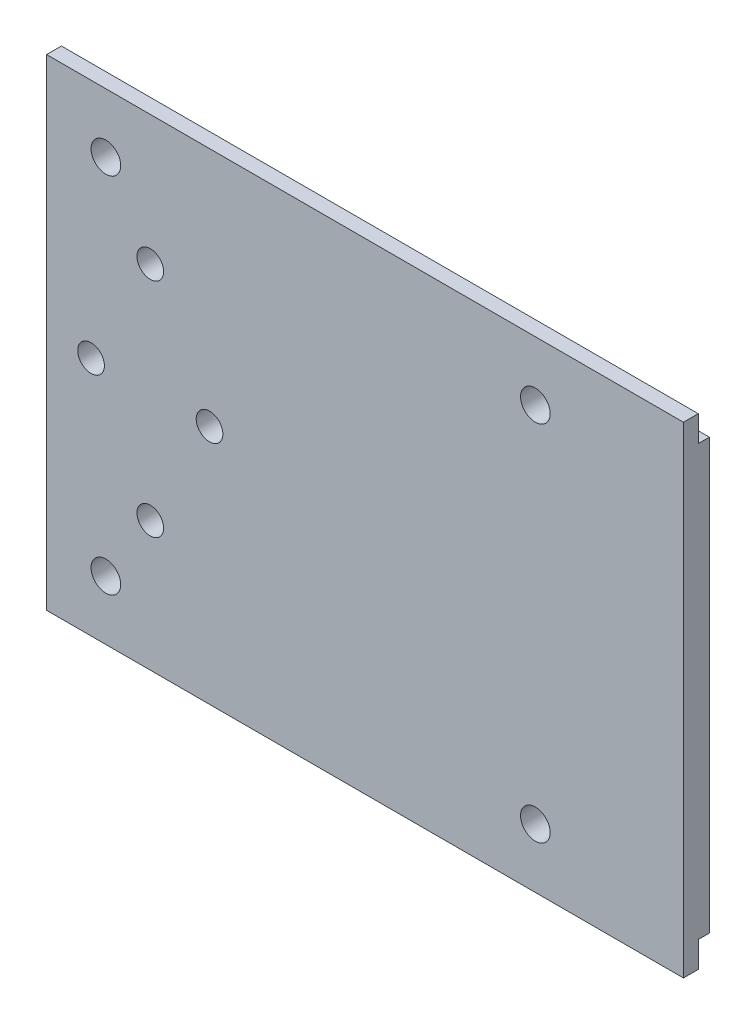
ISO-10303-21;
HEADER;
FILE_DESCRIPTION(('STEP AP214'),'2;1');
FILE_NAME('part.step','',(''),(''),'','','');
FILE_SCHEMA(('AUTOMOTIVE_DESIGN { 1 0 10303 214 1 1 1 1 }'));
ENDSEC;
DATA;
#1=APPLICATION_CONTEXT('core data for automotive mechanical design processes');
#2=APPLICATION_PROTOCOL_DEFINITION('international standard','automotive_design',2000,#1);
#3=PRODUCT_CONTEXT('',#1,'mechanical');
#4=PRODUCT('Part','Part','',(#3));
#5=PRODUCT_RELATED_PRODUCT_CATEGORY('part','',(#4));
#6=PRODUCT_DEFINITION_FORMATION('','',#4);
#7=PRODUCT_DEFINITION_CONTEXT('part definition',#1,'design');
#8=PRODUCT_DEFINITION('design','',#6,#7);
#9=PRODUCT_DEFINITION_SHAPE('','',#8);
#10=(LENGTH_UNIT() NAMED_UNIT(*) SI_UNIT(.MILLI.,.METRE.));
#11=(NAMED_UNIT(*) PLANE_ANGLE_UNIT() SI_UNIT($,.RADIAN.));
#12=(NAMED_UNIT(*) SI_UNIT($,.STERADIAN.) SOLID_ANGLE_UNIT());
#13=UNCERTAINTY_MEASURE_WITH_UNIT(LENGTH_MEASURE(1.E-05),#10,'distance_accuracy_value','');
#14=(GEOMETRIC_REPRESENTATION_CONTEXT(3) GLOBAL_UNCERTAINTY_ASSIGNED_CONTEXT((#13)) GLOBAL_UNIT_ASSIGNED_CONTEXT((#10,
#11,#12)) REPRESENTATION_CONTEXT('',''));
#15=CARTESIAN_POINT('',(0.,0.,0.));
#16=DIRECTION('',(0.,0.,1.));
#17=DIRECTION('',(1.,0.,0.));
#18=AXIS2_PLACEMENT_3D('',#15,#16,#17);
#19=CARTESIAN_POINT('',(-42.,24.5,-1.500025));
#20=DIRECTION('',(0.,0.,1.));
#21=DIRECTION('',(1.,0.,0.));
#22=AXIS2_PLACEMENT_3D('',#19,#20,#21);
#23=CYLINDRICAL_SURFACE('',#22,2.);
#24=CARTESIAN_POINT('',(-42.,24.5,2.));
#25=DIRECTION('',(0.,0.,1.));
#26=DIRECTION('',(1.,0.,0.));
#27=AXIS2_PLACEMENT_3D('',#24,#25,#26);
#28=CIRCLE('',#27,2.);
#29=CARTESIAN_POINT('',(-40.,24.5,2.));
#30=VERTEX_POINT('',#29);
#31=EDGE_CURVE('E162',#30,#30,#28,.T.);
#32=ORIENTED_EDGE('',*,*,#31,.T.);
#33=EDGE_LOOP('',(#32));
#34=FACE_BOUND('',#33,.T.);
#35=CARTESIAN_POINT('',(-42.,24.5,-1.));
#36=DIRECTION('',(0.,0.,-1.));
#37=DIRECTION('',(-1.,0.,0.));
#38=AXIS2_PLACEMENT_3D('',#35,#36,#37);
#39=CIRCLE('',#38,2.);
#40=CARTESIAN_POINT('',(-44.,24.5,-1.));
#41=VERTEX_POINT('',#40);
#42=EDGE_CURVE('E36',#41,#41,#39,.F.);
#43=ORIENTED_EDGE('',*,*,#42,.F.);
#44=EDGE_LOOP('',(#43));
#45=FACE_BOUND('',#44,.T.);
#46=ADVANCED_FACE('F32',(#34,#45),#23,.F.);
#47=CARTESIAN_POINT('',(-42.,-24.5,-1.500025));
#48=DIRECTION('',(0.,0.,1.));
#49=DIRECTION('',(1.,0.,0.));
#50=AXIS2_PLACEMENT_3D('',#47,#48,#49);
#51=CYLINDRICAL_SURFACE('',#50,2.);
#52=CARTESIAN_POINT('',(-42.,-24.5,2.));
#53=DIRECTION('',(0.,0.,1.));
#54=DIRECTION('',(1.,0.,0.));
#55=AXIS2_PLACEMENT_3D('',#52,#53,#54);
#56=CIRCLE('',#55,2.);
#57=CARTESIAN_POINT('',(-40.,-24.5,2.));
#58=VERTEX_POINT('',#57);
#59=EDGE_CURVE('E174',#58,#58,#56,.T.);
#60=ORIENTED_EDGE('',*,*,#59,.T.);
#61=EDGE_LOOP('',(#60));
#62=FACE_BOUND('',#61,.T.);
#63=CARTESIAN_POINT('',(-42.,-24.5,-1.));
#64=DIRECTION('',(0.,0.,-1.));
#65=DIRECTION('',(-1.,0.,0.));
#66=AXIS2_PLACEMENT_3D('',#63,#64,#65);
#67=CIRCLE('',#66,2.);
#68=CARTESIAN_POINT('',(-44.,-24.5,-1.));
#69=VERTEX_POINT('',#68);
#70=EDGE_CURVE('E213',#69,#69,#67,.F.);
#71=ORIENTED_EDGE('',*,*,#70,.F.);
#72=EDGE_LOOP('',(#71));
#73=FACE_BOUND('',#72,.T.);
#74=ADVANCED_FACE('F235',(#62,#73),#51,.F.);
#75=CARTESIAN_POINT('',(16.,-24.5,-1.500025));
#76=DIRECTION('',(0.,0.,1.));
#77=DIRECTION('',(1.,0.,0.));
#78=AXIS2_PLACEMENT_3D('',#75,#76,#77);
#79=CYLINDRICAL_SURFACE('',#78,2.00000000000001);
#80=CARTESIAN_POINT('',(16.,-24.5,2.));
#81=DIRECTION('',(0.,0.,1.));
#82=DIRECTION('',(1.,0.,0.));
#83=AXIS2_PLACEMENT_3D('',#80,#81,#82);
#84=CIRCLE('',#83,2.00000000000001);
#85=CARTESIAN_POINT('',(18.,-24.5,2.));
#86=VERTEX_POINT('',#85);
#87=EDGE_CURVE('E171',#86,#86,#84,.T.);
#88=ORIENTED_EDGE('',*,*,#87,.T.);
#89=EDGE_LOOP('',(#88));
#90=FACE_BOUND('',#89,.T.);
#91=CARTESIAN_POINT('',(16.,-24.5,-1.));
#92=DIRECTION('',(0.,0.,-1.));
#93=DIRECTION('',(-1.,0.,0.));
#94=AXIS2_PLACEMENT_3D('',#91,#92,#93);
#95=CIRCLE('',#94,2.00000000000001);
#96=CARTESIAN_POINT('',(14.,-24.5,-1.));
#97=VERTEX_POINT('',#96);
#98=EDGE_CURVE('E206',#97,#97,#95,.F.);
#99=ORIENTED_EDGE('',*,*,#98,.F.);
#100=EDGE_LOOP('',(#99));
#101=FACE_BOUND('',#100,.T.);
#102=ADVANCED_FACE('F241',(#90,#101),#79,.F.);
#103=CARTESIAN_POINT('',(16.,24.5,-1.500025));
#104=DIRECTION('',(0.,0.,1.));
#105=DIRECTION('',(1.,0.,0.));
#106=AXIS2_PLACEMENT_3D('',#103,#104,#105);
#107=CYLINDRICAL_SURFACE('',#106,2.);
#108=CARTESIAN_POINT('',(16.,24.5,2.));
#109=DIRECTION('',(0.,0.,1.));
#110=DIRECTION('',(1.,0.,0.));
#111=AXIS2_PLACEMENT_3D('',#108,#109,#110);
#112=CIRCLE('',#111,2.);
#113=CARTESIAN_POINT('',(18.,24.5,2.));
#114=VERTEX_POINT('',#113);
#115=EDGE_CURVE('E164',#114,#114,#112,.T.);
#116=ORIENTED_EDGE('',*,*,#115,.T.);
#117=EDGE_LOOP('',(#116));
#118=FACE_BOUND('',#117,.T.);
#119=CARTESIAN_POINT('',(16.,24.5,-1.));
#120=DIRECTION('',(0.,0.,-1.));
#121=DIRECTION('',(-1.,0.,0.));
#122=AXIS2_PLACEMENT_3D('',#119,#120,#121);
#123=CIRCLE('',#122,2.);
#124=CARTESIAN_POINT('',(14.,24.5,-1.));
#125=VERTEX_POINT('',#124);
#126=EDGE_CURVE('E201',#125,#125,#123,.F.);
#127=ORIENTED_EDGE('',*,*,#126,.F.);
#128=EDGE_LOOP('',(#127));
#129=FACE_BOUND('',#128,.T.);
#130=ADVANCED_FACE('F246',(#118,#129),#107,.F.);
#131=CARTESIAN_POINT('',(-46.5,29.,-1.5));
#132=DIRECTION('',(-1.,0.,0.));
#133=DIRECTION('',(0.,-1.,0.));
#134=AXIS2_PLACEMENT_3D('',#131,#132,#133);
#135=PLANE('',#134);
#136=DIRECTION('',(0.,-1.,0.));
#137=VECTOR('',#136,1.);
#138=CARTESIAN_POINT('',(-46.5,29.,0.));
#139=LINE('',#138,#137);
#140=CARTESIAN_POINT('',(-46.5,29.,0.));
#141=VERTEX_POINT('',#140);
#142=CARTESIAN_POINT('',(-46.5,-29.,0.));
#143=VERTEX_POINT('',#142);
#144=EDGE_CURVE('E129',#141,#143,#139,.T.);
#145=ORIENTED_EDGE('',*,*,#144,.F.);
#146=DIRECTION('',(0.,0.,1.));
#147=VECTOR('',#146,1.);
#148=CARTESIAN_POINT('',(-46.5,29.,-1.5));
#149=LINE('',#148,#147);
#150=CARTESIAN_POINT('',(-46.5,29.,-1.5));
#151=VERTEX_POINT('',#150);
#152=EDGE_CURVE('E11',#151,#141,#149,.T.);
#153=ORIENTED_EDGE('',*,*,#152,.F.);
#154=DIRECTION('',(0.,-1.,0.));
#155=VECTOR('',#154,1.);
#156=CARTESIAN_POINT('',(-46.5,29.,-1.5));
#157=LINE('',#156,#155);
#158=CARTESIAN_POINT('',(-46.5,-29.,-1.5));
#159=VERTEX_POINT('',#158);
#160=EDGE_CURVE('E527',#151,#159,#157,.T.);
#161=ORIENTED_EDGE('',*,*,#160,.T.);
#162=DIRECTION('',(0.,0.,1.));
#163=VECTOR('',#162,1.);
#164=CARTESIAN_POINT('',(-46.5,-29.,-1.5));
#165=LINE('',#164,#163);
#166=EDGE_CURVE('E75',#159,#143,#165,.T.);
#167=ORIENTED_EDGE('',*,*,#166,.T.);
#168=EDGE_LOOP('',(#145,#153,#161,#167));
#169=FACE_BOUND('',#168,.T.);
#170=ADVANCED_FACE('F34',(#169),#135,.T.);
#171=CARTESIAN_POINT('',(-46.5,29.,-1.5));
#172=DIRECTION('',(0.,1.,0.));
#173=DIRECTION('',(0.,0.,1.));
#174=AXIS2_PLACEMENT_3D('',#171,#172,#173);
#175=PLANE('',#174);
#176=DIRECTION('',(-1.,0.,0.));
#177=VECTOR('',#176,1.);
#178=CARTESIAN_POINT('',(-46.5,29.,0.));
#179=LINE('',#178,#177);
#180=CARTESIAN_POINT('',(36.,29.,0.));
#181=VERTEX_POINT('',#180);
#182=EDGE_CURVE('E274',#181,#141,#179,.T.);
#183=ORIENTED_EDGE('',*,*,#182,.F.);
#184=DIRECTION('',(0.,0.,1.));
#185=VECTOR('',#184,1.);
#186=CARTESIAN_POINT('',(36.,29.,-1.5));
#187=LINE('',#186,#185);
#188=CARTESIAN_POINT('',(36.,29.,-1.5));
#189=VERTEX_POINT('',#188);
#190=EDGE_CURVE('E42',#189,#181,#187,.T.);
#191=ORIENTED_EDGE('',*,*,#190,.F.);
#192=DIRECTION('',(-1.,0.,0.));
#193=VECTOR('',#192,1.);
#194=CARTESIAN_POINT('',(-46.5,29.,-1.5));
#195=LINE('',#194,#193);
#196=EDGE_CURVE('E278',#189,#151,#195,.T.);
#197=ORIENTED_EDGE('',*,*,#196,.T.);
#198=ORIENTED_EDGE('',*,*,#152,.T.);
#199=EDGE_LOOP('',(#183,#191,#197,#198));
#200=FACE_BOUND('',#199,.T.);
#201=ADVANCED_FACE('F265',(#200),#175,.T.);
#202=CARTESIAN_POINT('',(36.,29.,-1.5));
#203=DIRECTION('',(1.,0.,0.));
#204=DIRECTION('',(0.,0.,-1.));
#205=AXIS2_PLACEMENT_3D('',#202,#203,#204);
#206=PLANE('',#205);
#207=ORIENTED_EDGE('',*,*,#190,.T.);
#208=DIRECTION('',(0.,1.,0.));
#209=VECTOR('',#208,1.);
#210=CARTESIAN_POINT('',(36.,32.5,0.));
#211=LINE('',#210,#209);
#212=CARTESIAN_POINT('',(36.,32.5,0.));
#213=VERTEX_POINT('',#212);
#214=EDGE_CURVE('E142',#181,#213,#211,.T.);
#215=ORIENTED_EDGE('',*,*,#214,.T.);
#216=DIRECTION('',(0.,0.,-1.));
#217=VECTOR('',#216,1.);
#218=CARTESIAN_POINT('',(36.,32.5,2.));
#219=LINE('',#218,#217);
#220=CARTESIAN_POINT('',(36.,32.5,2.));
#221=VERTEX_POINT('',#220);
#222=EDGE_CURVE('E134',#221,#213,#219,.T.);
#223=ORIENTED_EDGE('',*,*,#222,.F.);
#224=DIRECTION('',(0.,1.,0.));
#225=VECTOR('',#224,1.);
#226=CARTESIAN_POINT('',(36.,32.5,2.));
#227=LINE('',#226,#225);
#228=CARTESIAN_POINT('',(36.,-32.5,2.));
#229=VERTEX_POINT('',#228);
#230=EDGE_CURVE('E114',#229,#221,#227,.T.);
#231=ORIENTED_EDGE('',*,*,#230,.F.);
#232=DIRECTION('',(0.,0.,-1.));
#233=VECTOR('',#232,1.);
#234=CARTESIAN_POINT('',(36.,-32.5,2.));
#235=LINE('',#234,#233);
#236=CARTESIAN_POINT('',(36.,-32.5,0.));
#237=VERTEX_POINT('',#236);
#238=EDGE_CURVE('E111',#229,#237,#235,.T.);
#239=ORIENTED_EDGE('',*,*,#238,.T.);
#240=CARTESIAN_POINT('',(36.,-29.,0.));
#241=VERTEX_POINT('',#240);
#242=EDGE_CURVE('E138',#237,#241,#211,.T.);
#243=ORIENTED_EDGE('',*,*,#242,.T.);
#244=DIRECTION('',(0.,0.,1.));
#245=VECTOR('',#244,1.);
#246=CARTESIAN_POINT('',(36.,-29.,-1.5));
#247=LINE('',#246,#245);
#248=CARTESIAN_POINT('',(36.,-29.,-1.5));
#249=VERTEX_POINT('',#248);
#250=EDGE_CURVE('E65',#249,#241,#247,.T.);
#251=ORIENTED_EDGE('',*,*,#250,.F.);
#252=DIRECTION('',(0.,1.,0.));
#253=VECTOR('',#252,1.);
#254=CARTESIAN_POINT('',(36.,29.,-1.5));
#255=LINE('',#254,#253);
#256=EDGE_CURVE('E281',#249,#189,#255,.T.);
#257=ORIENTED_EDGE('',*,*,#256,.T.);
#258=EDGE_LOOP('',(#207,#215,#223,#231,#239,#243,#251,#257));
#259=FACE_BOUND('',#258,.T.);
#260=ADVANCED_FACE('F268',(#259),#206,.T.);
#261=CARTESIAN_POINT('',(-46.5,-29.,-1.5));
#262=DIRECTION('',(0.,-1.,0.));
#263=DIRECTION('',(0.,0.,-1.));
#264=AXIS2_PLACEMENT_3D('',#261,#262,#263);
#265=PLANE('',#264);
#266=DIRECTION('',(1.,0.,0.));
#267=VECTOR('',#266,1.);
#268=CARTESIAN_POINT('',(-46.5,-29.,0.));
#269=LINE('',#268,#267);
#270=EDGE_CURVE('E132',#143,#241,#269,.T.);
#271=ORIENTED_EDGE('',*,*,#270,.F.);
#272=ORIENTED_EDGE('',*,*,#166,.F.);
#273=DIRECTION('',(1.,0.,0.));
#274=VECTOR('',#273,1.);
#275=CARTESIAN_POINT('',(-46.5,-29.,-1.5));
#276=LINE('',#275,#274);
#277=EDGE_CURVE('E284',#159,#249,#276,.T.);
#278=ORIENTED_EDGE('',*,*,#277,.T.);
#279=ORIENTED_EDGE('',*,*,#250,.T.);
#280=EDGE_LOOP('',(#271,#272,#278,#279));
#281=FACE_BOUND('',#280,.T.);
#282=ADVANCED_FACE('F263',(#281),#265,.T.);
#283=CARTESIAN_POINT('',(0.,0.,-1.5));
#284=DIRECTION('',(0.,0.,1.));
#285=DIRECTION('',(1.,0.,0.));
#286=AXIS2_PLACEMENT_3D('',#283,#284,#285);
#287=PLANE('',#286);
#288=CARTESIAN_POINT('',(-42.,24.5,-1.5));
#289=DIRECTION('',(0.,0.,-1.));
#290=DIRECTION('',(-1.,0.,0.));
#291=AXIS2_PLACEMENT_3D('',#288,#289,#290);
#292=CIRCLE('',#291,4.00000000000001);
#293=CARTESIAN_POINT('',(-46.,24.5,-1.5));
#294=VERTEX_POINT('',#293);
#295=EDGE_CURVE('E222',#294,#294,#292,.T.);
#296=ORIENTED_EDGE('',*,*,#295,.F.);
#297=EDGE_LOOP('',(#296));
#298=FACE_BOUND('',#297,.T.);
#299=CARTESIAN_POINT('',(-42.,-24.5,-1.5));
#300=DIRECTION('',(0.,0.,-1.));
#301=DIRECTION('',(-1.,0.,0.));
#302=AXIS2_PLACEMENT_3D('',#299,#300,#301);
#303=CIRCLE('',#302,4.);
#304=CARTESIAN_POINT('',(-46.,-24.5,-1.5));
#305=VERTEX_POINT('',#304);
#306=EDGE_CURVE('E216',#305,#305,#303,.T.);
#307=ORIENTED_EDGE('',*,*,#306,.F.);
#308=EDGE_LOOP('',(#307));
#309=FACE_BOUND('',#308,.T.);
#310=CARTESIAN_POINT('',(16.,-24.5,-1.5));
#311=DIRECTION('',(0.,0.,-1.));
#312=DIRECTION('',(-1.,0.,0.));
#313=AXIS2_PLACEMENT_3D('',#310,#311,#312);
#314=CIRCLE('',#313,4.);
#315=CARTESIAN_POINT('',(12.,-24.5,-1.5));
#316=VERTEX_POINT('',#315);
#317=EDGE_CURVE('E209',#316,#316,#314,.T.);
#318=ORIENTED_EDGE('',*,*,#317,.F.);
#319=EDGE_LOOP('',(#318));
#320=FACE_BOUND('',#319,.T.);
#321=CARTESIAN_POINT('',(16.,24.5,-1.5));
#322=DIRECTION('',(0.,0.,-1.));
#323=DIRECTION('',(-1.,0.,0.));
#324=AXIS2_PLACEMENT_3D('',#321,#322,#323);
#325=CIRCLE('',#324,4.);
#326=CARTESIAN_POINT('',(12.,24.5,-1.5));
#327=VERTEX_POINT('',#326);
#328=EDGE_CURVE('E202',#327,#327,#325,.T.);
#329=ORIENTED_EDGE('',*,*,#328,.F.);
#330=EDGE_LOOP('',(#329));
#331=FACE_BOUND('',#330,.T.);
#332=CARTESIAN_POINT('',(-36.,-15.,-1.5));
#333=DIRECTION('',(0.,0.,1.));
#334=DIRECTION('',(1.,0.,0.));
#335=AXIS2_PLACEMENT_3D('',#332,#333,#334);
#336=CIRCLE('',#335,1.8);
#337=CARTESIAN_POINT('',(-34.2,-15.,-1.5));
#338=VERTEX_POINT('',#337);
#339=EDGE_CURVE('E195',#338,#338,#336,.T.);
#340=ORIENTED_EDGE('',*,*,#339,.T.);
#341=EDGE_LOOP('',(#340));
#342=FACE_BOUND('',#341,.T.);
#343=CARTESIAN_POINT('',(-36.,15.,-1.5));
#344=DIRECTION('',(0.,0.,1.));
#345=DIRECTION('',(1.,0.,0.));
#346=AXIS2_PLACEMENT_3D('',#343,#344,#345);
#347=CIRCLE('',#346,1.8);
#348=CARTESIAN_POINT('',(-34.2,15.,-1.5));
#349=VERTEX_POINT('',#348);
#350=EDGE_CURVE('E189',#349,#349,#347,.T.);
#351=ORIENTED_EDGE('',*,*,#350,.T.);
#352=EDGE_LOOP('',(#351));
#353=FACE_BOUND('',#352,.T.);
#354=CARTESIAN_POINT('',(-28.,0.,-1.5));
#355=DIRECTION('',(0.,0.,1.));
#356=DIRECTION('',(1.,0.,0.));
#357=AXIS2_PLACEMENT_3D('',#354,#355,#356);
#358=CIRCLE('',#357,1.8);
#359=CARTESIAN_POINT('',(-26.2,0.,-1.5));
#360=VERTEX_POINT('',#359);
#361=EDGE_CURVE('E183',#360,#360,#358,.T.);
#362=ORIENTED_EDGE('',*,*,#361,.T.);
#363=EDGE_LOOP('',(#362));
#364=FACE_BOUND('',#363,.T.);
#365=CARTESIAN_POINT('',(-44.,0.,-1.5));
#366=DIRECTION('',(0.,0.,1.));
#367=DIRECTION('',(1.,0.,0.));
#368=AXIS2_PLACEMENT_3D('',#365,#366,#367);
#369=CIRCLE('',#368,1.8);
#370=CARTESIAN_POINT('',(-42.2,0.,-1.5));
#371=VERTEX_POINT('',#370);
#372=EDGE_CURVE('E177',#371,#371,#369,.T.);
#373=ORIENTED_EDGE('',*,*,#372,.T.);
#374=EDGE_LOOP('',(#373));
#375=FACE_BOUND('',#374,.T.);
#376=ORIENTED_EDGE('',*,*,#160,.F.);
#377=ORIENTED_EDGE('',*,*,#196,.F.);
#378=ORIENTED_EDGE('',*,*,#256,.F.);
#379=ORIENTED_EDGE('',*,*,#277,.F.);
#380=EDGE_LOOP('',(#376,#377,#378,#379));
#381=FACE_BOUND('',#380,.T.);
#382=ADVANCED_FACE('F254',(#298,#309,#320,#331,#342,#353,#364,#375,#381),#287,.F.);
#383=CARTESIAN_POINT('',(0.,0.,0.));
#384=DIRECTION('',(0.,0.,1.));
#385=DIRECTION('',(1.,0.,0.));
#386=AXIS2_PLACEMENT_3D('',#383,#384,#385);
#387=PLANE('',#386);
#388=ORIENTED_EDGE('',*,*,#144,.T.);
#389=ORIENTED_EDGE('',*,*,#270,.T.);
#390=ORIENTED_EDGE('',*,*,#242,.F.);
#391=DIRECTION('',(1.,0.,0.));
#392=VECTOR('',#391,1.);
#393=CARTESIAN_POINT('',(-50.,-32.5,0.));
#394=LINE('',#393,#392);
#395=CARTESIAN_POINT('',(-50.,-32.5,0.));
#396=VERTEX_POINT('',#395);
#397=EDGE_CURVE('E147',#396,#237,#394,.T.);
#398=ORIENTED_EDGE('',*,*,#397,.F.);
#399=DIRECTION('',(0.,-1.,0.));
#400=VECTOR('',#399,1.);
#401=CARTESIAN_POINT('',(-50.,32.5,0.));
#402=LINE('',#401,#400);
#403=CARTESIAN_POINT('',(-50.,32.5,0.));
#404=VERTEX_POINT('',#403);
#405=EDGE_CURVE('E128',#404,#396,#402,.T.);
#406=ORIENTED_EDGE('',*,*,#405,.F.);
#407=DIRECTION('',(-1.,0.,0.));
#408=VECTOR('',#407,1.);
#409=CARTESIAN_POINT('',(-50.,32.5,0.));
#410=LINE('',#409,#408);
#411=EDGE_CURVE('E124',#213,#404,#410,.T.);
#412=ORIENTED_EDGE('',*,*,#411,.F.);
#413=ORIENTED_EDGE('',*,*,#214,.F.);
#414=ORIENTED_EDGE('',*,*,#182,.T.);
#415=EDGE_LOOP('',(#388,#389,#390,#398,#406,#412,#413,#414));
#416=FACE_BOUND('',#415,.T.);
#417=ADVANCED_FACE('F159',(#416),#387,.F.);
#418=CARTESIAN_POINT('',(-50.,32.5,2.));
#419=DIRECTION('',(1.,0.,0.));
#420=DIRECTION('',(0.,1.,0.));
#421=AXIS2_PLACEMENT_3D('',#418,#419,#420);
#422=PLANE('',#421);
#423=ORIENTED_EDGE('',*,*,#405,.T.);
#424=DIRECTION('',(0.,0.,-1.));
#425=VECTOR('',#424,1.);
#426=CARTESIAN_POINT('',(-50.,-32.5,2.));
#427=LINE('',#426,#425);
#428=CARTESIAN_POINT('',(-50.,-32.5,2.));
#429=VERTEX_POINT('',#428);
#430=EDGE_CURVE('E108',#429,#396,#427,.T.);
#431=ORIENTED_EDGE('',*,*,#430,.F.);
#432=DIRECTION('',(0.,-1.,0.));
#433=VECTOR('',#432,1.);
#434=CARTESIAN_POINT('',(-50.,32.5,2.));
#435=LINE('',#434,#433);
#436=CARTESIAN_POINT('',(-50.,32.5,2.));
#437=VERTEX_POINT('',#436);
#438=EDGE_CURVE('E115',#437,#429,#435,.T.);
#439=ORIENTED_EDGE('',*,*,#438,.F.);
#440=DIRECTION('',(0.,0.,-1.));
#441=VECTOR('',#440,1.);
#442=CARTESIAN_POINT('',(-50.,32.5,2.));
#443=LINE('',#442,#441);
#444=EDGE_CURVE('E151',#437,#404,#443,.T.);
#445=ORIENTED_EDGE('',*,*,#444,.T.);
#446=EDGE_LOOP('',(#423,#431,#439,#445));
#447=FACE_BOUND('',#446,.T.);
#448=ADVANCED_FACE('F126',(#447),#422,.F.);
#449=CARTESIAN_POINT('',(-50.,-32.5,2.));
#450=DIRECTION('',(0.,1.,0.));
#451=DIRECTION('',(-1.,0.,0.));
#452=AXIS2_PLACEMENT_3D('',#449,#450,#451);
#453=PLANE('',#452);
#454=ORIENTED_EDGE('',*,*,#397,.T.);
#455=ORIENTED_EDGE('',*,*,#238,.F.);
#456=DIRECTION('',(1.,0.,0.));
#457=VECTOR('',#456,1.);
#458=CARTESIAN_POINT('',(-50.,-32.5,2.));
#459=LINE('',#458,#457);
#460=EDGE_CURVE('E104',#429,#229,#459,.T.);
#461=ORIENTED_EDGE('',*,*,#460,.F.);
#462=ORIENTED_EDGE('',*,*,#430,.T.);
#463=EDGE_LOOP('',(#454,#455,#461,#462));
#464=FACE_BOUND('',#463,.T.);
#465=ADVANCED_FACE('F106',(#464),#453,.F.);
#466=CARTESIAN_POINT('',(-50.,32.5,2.));
#467=DIRECTION('',(0.,-1.,0.));
#468=DIRECTION('',(0.,0.,-1.));
#469=AXIS2_PLACEMENT_3D('',#466,#467,#468);
#470=PLANE('',#469);
#471=ORIENTED_EDGE('',*,*,#411,.T.);
#472=ORIENTED_EDGE('',*,*,#444,.F.);
#473=DIRECTION('',(-1.,0.,0.));
#474=VECTOR('',#473,1.);
#475=CARTESIAN_POINT('',(-50.,32.5,2.));
#476=LINE('',#475,#474);
#477=EDGE_CURVE('E120',#221,#437,#476,.T.);
#478=ORIENTED_EDGE('',*,*,#477,.F.);
#479=ORIENTED_EDGE('',*,*,#222,.T.);
#480=EDGE_LOOP('',(#471,#472,#478,#479));
#481=FACE_BOUND('',#480,.T.);
#482=ADVANCED_FACE('F156',(#481),#470,.F.);
#483=CARTESIAN_POINT('',(0.,0.,2.));
#484=DIRECTION('',(0.,0.,1.));
#485=DIRECTION('',(1.,0.,0.));
#486=AXIS2_PLACEMENT_3D('',#483,#484,#485);
#487=PLANE('',#486);
#488=CARTESIAN_POINT('',(-36.,-15.,2.));
#489=DIRECTION('',(0.,0.,1.));
#490=DIRECTION('',(-1.,0.,0.));
#491=AXIS2_PLACEMENT_3D('',#488,#489,#490);
#492=CIRCLE('',#491,1.8);
#493=CARTESIAN_POINT('',(-37.8,-15.,2.));
#494=VERTEX_POINT('',#493);
#495=EDGE_CURVE('E198',#494,#494,#492,.T.);
#496=ORIENTED_EDGE('',*,*,#495,.F.);
#497=EDGE_LOOP('',(#496));
#498=FACE_BOUND('',#497,.T.);
#499=CARTESIAN_POINT('',(-36.,15.,2.));
#500=DIRECTION('',(0.,0.,1.));
#501=DIRECTION('',(1.,0.,0.));
#502=AXIS2_PLACEMENT_3D('',#499,#500,#501);
#503=CIRCLE('',#502,1.8);
#504=CARTESIAN_POINT('',(-34.2,15.,2.));
#505=VERTEX_POINT('',#504);
#506=EDGE_CURVE('E192',#505,#505,#503,.T.);
#507=ORIENTED_EDGE('',*,*,#506,.F.);
#508=EDGE_LOOP('',(#507));
#509=FACE_BOUND('',#508,.T.);
#510=CARTESIAN_POINT('',(-28.,0.,2.));
#511=DIRECTION('',(0.,0.,1.));
#512=DIRECTION('',(1.,0.,0.));
#513=AXIS2_PLACEMENT_3D('',#510,#511,#512);
#514=CIRCLE('',#513,1.8);
#515=CARTESIAN_POINT('',(-26.2,0.,2.));
#516=VERTEX_POINT('',#515);
#517=EDGE_CURVE('E186',#516,#516,#514,.T.);
#518=ORIENTED_EDGE('',*,*,#517,.F.);
#519=EDGE_LOOP('',(#518));
#520=FACE_BOUND('',#519,.T.);
#521=CARTESIAN_POINT('',(-44.,0.,2.));
#522=DIRECTION('',(0.,0.,1.));
#523=DIRECTION('',(1.,0.,0.));
#524=AXIS2_PLACEMENT_3D('',#521,#522,#523);
#525=CIRCLE('',#524,1.8);
#526=CARTESIAN_POINT('',(-42.2,0.,2.));
#527=VERTEX_POINT('',#526);
#528=EDGE_CURVE('E180',#527,#527,#525,.T.);
#529=ORIENTED_EDGE('',*,*,#528,.F.);
#530=EDGE_LOOP('',(#529));
#531=FACE_BOUND('',#530,.T.);
#532=ORIENTED_EDGE('',*,*,#59,.F.);
#533=EDGE_LOOP('',(#532));
#534=FACE_BOUND('',#533,.T.);
#535=ORIENTED_EDGE('',*,*,#87,.F.);
#536=EDGE_LOOP('',(#535));
#537=FACE_BOUND('',#536,.T.);
#538=ORIENTED_EDGE('',*,*,#115,.F.);
#539=EDGE_LOOP('',(#538));
#540=FACE_BOUND('',#539,.T.);
#541=ORIENTED_EDGE('',*,*,#31,.F.);
#542=EDGE_LOOP('',(#541));
#543=FACE_BOUND('',#542,.T.);
#544=ORIENTED_EDGE('',*,*,#438,.T.);
#545=ORIENTED_EDGE('',*,*,#460,.T.);
#546=ORIENTED_EDGE('',*,*,#230,.T.);
#547=ORIENTED_EDGE('',*,*,#477,.T.);
#548=EDGE_LOOP('',(#544,#545,#546,#547));
#549=FACE_BOUND('',#548,.T.);
#550=ADVANCED_FACE('F118',(#498,#509,#520,#531,#534,#537,#540,#543,#549),#487,.T.);
#551=CARTESIAN_POINT('',(-44.,0.,-1.500025));
#552=DIRECTION('',(0.,0.,1.));
#553=DIRECTION('',(1.,0.,0.));
#554=AXIS2_PLACEMENT_3D('',#551,#552,#553);
#555=CYLINDRICAL_SURFACE('',#554,1.8);
#556=ORIENTED_EDGE('',*,*,#528,.T.);
#557=EDGE_LOOP('',(#556));
#558=FACE_BOUND('',#557,.T.);
#559=ORIENTED_EDGE('',*,*,#372,.F.);
#560=EDGE_LOOP('',(#559));
#561=FACE_BOUND('',#560,.T.);
#562=ADVANCED_FACE('F250',(#558,#561),#555,.F.);
#563=CARTESIAN_POINT('',(-28.,0.,-1.500025));
#564=DIRECTION('',(0.,0.,1.));
#565=DIRECTION('',(1.,0.,0.));
#566=AXIS2_PLACEMENT_3D('',#563,#564,#565);
#567=CYLINDRICAL_SURFACE('',#566,1.8);
#568=ORIENTED_EDGE('',*,*,#517,.T.);
#569=EDGE_LOOP('',(#568));
#570=FACE_BOUND('',#569,.T.);
#571=ORIENTED_EDGE('',*,*,#361,.F.);
#572=EDGE_LOOP('',(#571));
#573=FACE_BOUND('',#572,.T.);
#574=ADVANCED_FACE('F337',(#570,#573),#567,.F.);
#575=CARTESIAN_POINT('',(-36.,15.,-1.500025));
#576=DIRECTION('',(0.,0.,1.));
#577=DIRECTION('',(1.,0.,0.));
#578=AXIS2_PLACEMENT_3D('',#575,#576,#577);
#579=CYLINDRICAL_SURFACE('',#578,1.8);
#580=ORIENTED_EDGE('',*,*,#506,.T.);
#581=EDGE_LOOP('',(#580));
#582=FACE_BOUND('',#581,.T.);
#583=ORIENTED_EDGE('',*,*,#350,.F.);
#584=EDGE_LOOP('',(#583));
#585=FACE_BOUND('',#584,.T.);
#586=ADVANCED_FACE('F333',(#582,#585),#579,.F.);
#587=CARTESIAN_POINT('',(-36.,-15.,-1.500025));
#588=DIRECTION('',(0.,0.,1.));
#589=DIRECTION('',(1.,0.,0.));
#590=AXIS2_PLACEMENT_3D('',#587,#588,#589);
#591=CYLINDRICAL_SURFACE('',#590,1.8);
#592=ORIENTED_EDGE('',*,*,#495,.T.);
#593=EDGE_LOOP('',(#592));
#594=FACE_BOUND('',#593,.T.);
#595=ORIENTED_EDGE('',*,*,#339,.F.);
#596=EDGE_LOOP('',(#595));
#597=FACE_BOUND('',#596,.T.);
#598=ADVANCED_FACE('F326',(#594,#597),#591,.F.);
#599=CARTESIAN_POINT('',(16.,24.5,-1.));
#600=DIRECTION('',(0.,0.,-1.));
#601=DIRECTION('',(-1.,0.,0.));
#602=AXIS2_PLACEMENT_3D('',#599,#600,#601);
#603=PLANE('',#602);
#604=CARTESIAN_POINT('',(16.,24.5,-1.));
#605=DIRECTION('',(0.,0.,-1.));
#606=DIRECTION('',(-1.,0.,0.));
#607=AXIS2_PLACEMENT_3D('',#604,#605,#606);
#608=CIRCLE('',#607,4.);
#609=CARTESIAN_POINT('',(12.,24.5,-1.));
#610=VERTEX_POINT('',#609);
#611=EDGE_CURVE('E205',#610,#610,#608,.T.);
#612=ORIENTED_EDGE('',*,*,#611,.T.);
#613=EDGE_LOOP('',(#612));
#614=FACE_BOUND('',#613,.T.);
#615=ORIENTED_EDGE('',*,*,#126,.T.);
#616=EDGE_LOOP('',(#615));
#617=FACE_BOUND('',#616,.T.);
#618=ADVANCED_FACE('F323',(#614,#617),#603,.T.);
#619=CARTESIAN_POINT('',(16.,24.5,-1.));
#620=DIRECTION('',(0.,0.,-1.));
#621=DIRECTION('',(-1.,0.,0.));
#622=AXIS2_PLACEMENT_3D('',#619,#620,#621);
#623=CYLINDRICAL_SURFACE('',#622,4.);
#624=ORIENTED_EDGE('',*,*,#611,.F.);
#625=EDGE_LOOP('',(#624));
#626=FACE_BOUND('',#625,.T.);
#627=ORIENTED_EDGE('',*,*,#328,.T.);
#628=EDGE_LOOP('',(#627));
#629=FACE_BOUND('',#628,.T.);
#630=ADVANCED_FACE('F320',(#626,#629),#623,.F.);
#631=CARTESIAN_POINT('',(16.,-24.5,-1.));
#632=DIRECTION('',(0.,0.,-1.));
#633=DIRECTION('',(-1.,0.,0.));
#634=AXIS2_PLACEMENT_3D('',#631,#632,#633);
#635=PLANE('',#634);
#636=CARTESIAN_POINT('',(16.,-24.5,-1.));
#637=DIRECTION('',(0.,0.,-1.));
#638=DIRECTION('',(-1.,0.,0.));
#639=AXIS2_PLACEMENT_3D('',#636,#637,#638);
#640=CIRCLE('',#639,4.);
#641=CARTESIAN_POINT('',(12.,-24.5,-1.));
#642=VERTEX_POINT('',#641);
#643=EDGE_CURVE('E212',#642,#642,#640,.T.);
#644=ORIENTED_EDGE('',*,*,#643,.T.);
#645=EDGE_LOOP('',(#644));
#646=FACE_BOUND('',#645,.T.);
#647=ORIENTED_EDGE('',*,*,#98,.T.);
#648=EDGE_LOOP('',(#647));
#649=FACE_BOUND('',#648,.T.);
#650=ADVANCED_FACE('F312',(#646,#649),#635,.T.);
#651=CARTESIAN_POINT('',(16.,-24.5,-1.));
#652=DIRECTION('',(0.,0.,-1.));
#653=DIRECTION('',(-1.,0.,0.));
#654=AXIS2_PLACEMENT_3D('',#651,#652,#653);
#655=CYLINDRICAL_SURFACE('',#654,4.);
#656=ORIENTED_EDGE('',*,*,#643,.F.);
#657=EDGE_LOOP('',(#656));
#658=FACE_BOUND('',#657,.T.);
#659=ORIENTED_EDGE('',*,*,#317,.T.);
#660=EDGE_LOOP('',(#659));
#661=FACE_BOUND('',#660,.T.);
#662=ADVANCED_FACE('F303',(#658,#661),#655,.F.);
#663=CARTESIAN_POINT('',(-42.,-24.5,-1.));
#664=DIRECTION('',(0.,0.,-1.));
#665=DIRECTION('',(-1.,0.,0.));
#666=AXIS2_PLACEMENT_3D('',#663,#664,#665);
#667=PLANE('',#666);
#668=CARTESIAN_POINT('',(-42.,-24.5,-1.));
#669=DIRECTION('',(0.,0.,-1.));
#670=DIRECTION('',(-1.,0.,0.));
#671=AXIS2_PLACEMENT_3D('',#668,#669,#670);
#672=CIRCLE('',#671,4.);
#673=CARTESIAN_POINT('',(-46.,-24.5,-1.));
#674=VERTEX_POINT('',#673);
#675=EDGE_CURVE('E219',#674,#674,#672,.T.);
#676=ORIENTED_EDGE('',*,*,#675,.T.);
#677=EDGE_LOOP('',(#676));
#678=FACE_BOUND('',#677,.T.);
#679=ORIENTED_EDGE('',*,*,#70,.T.);
#680=EDGE_LOOP('',(#679));
#681=FACE_BOUND('',#680,.T.);
#682=ADVANCED_FACE('F299',(#678,#681),#667,.T.);
#683=CARTESIAN_POINT('',(-42.,-24.5,-1.));
#684=DIRECTION('',(0.,0.,-1.));
#685=DIRECTION('',(-1.,0.,0.));
#686=AXIS2_PLACEMENT_3D('',#683,#684,#685);
#687=CYLINDRICAL_SURFACE('',#686,4.);
#688=ORIENTED_EDGE('',*,*,#675,.F.);
#689=EDGE_LOOP('',(#688));
#690=FACE_BOUND('',#689,.T.);
#691=ORIENTED_EDGE('',*,*,#306,.T.);
#692=EDGE_LOOP('',(#691));
#693=FACE_BOUND('',#692,.T.);
#694=ADVANCED_FACE('F302',(#690,#693),#687,.F.);
#695=CARTESIAN_POINT('',(-42.,24.5,-1.));
#696=DIRECTION('',(0.,0.,-1.));
#697=DIRECTION('',(-1.,0.,0.));
#698=AXIS2_PLACEMENT_3D('',#695,#696,#697);
#699=PLANE('',#698);
#700=CARTESIAN_POINT('',(-42.,24.5,-1.));
#701=DIRECTION('',(0.,0.,-1.));
#702=DIRECTION('',(-1.,0.,0.));
#703=AXIS2_PLACEMENT_3D('',#700,#701,#702);
#704=CIRCLE('',#703,4.00000000000001);
#705=CARTESIAN_POINT('',(-46.,24.5,-1.));
#706=VERTEX_POINT('',#705);
#707=EDGE_CURVE('E225',#706,#706,#704,.T.);
#708=ORIENTED_EDGE('',*,*,#707,.T.);
#709=EDGE_LOOP('',(#708));
#710=FACE_BOUND('',#709,.T.);
#711=ORIENTED_EDGE('',*,*,#42,.T.);
#712=EDGE_LOOP('',(#711));
#713=FACE_BOUND('',#712,.T.);
#714=ADVANCED_FACE('F232',(#710,#713),#699,.T.);
#715=CARTESIAN_POINT('',(-42.,24.5,-1.));
#716=DIRECTION('',(0.,0.,-1.));
#717=DIRECTION('',(-1.,0.,0.));
#718=AXIS2_PLACEMENT_3D('',#715,#716,#717);
#719=CYLINDRICAL_SURFACE('',#718,4.00000000000001);
#720=ORIENTED_EDGE('',*,*,#707,.F.);
#721=EDGE_LOOP('',(#720));
#722=FACE_BOUND('',#721,.T.);
#723=ORIENTED_EDGE('',*,*,#295,.T.);
#724=EDGE_LOOP('',(#723));
#725=FACE_BOUND('',#724,.T.);
#726=ADVANCED_FACE('F316',(#722,#725),#719,.F.);
#727=CLOSED_SHELL('',(#46,#74,#102,#130,#170,#201,#260,#282,#382,#417,#448,#465,#482,#550,#562,
#574,#586,#598,#618,#630,#650,#662,#682,#694,#714,#726));
#728=MANIFOLD_SOLID_BREP('B2',#727);
#729=ADVANCED_BREP_SHAPE_REPRESENTATION('',(#18,#728),#14);
#730=SHAPE_DEFINITION_REPRESENTATION(#9,#729);
ENDSEC;
END-ISO-10303-21;
